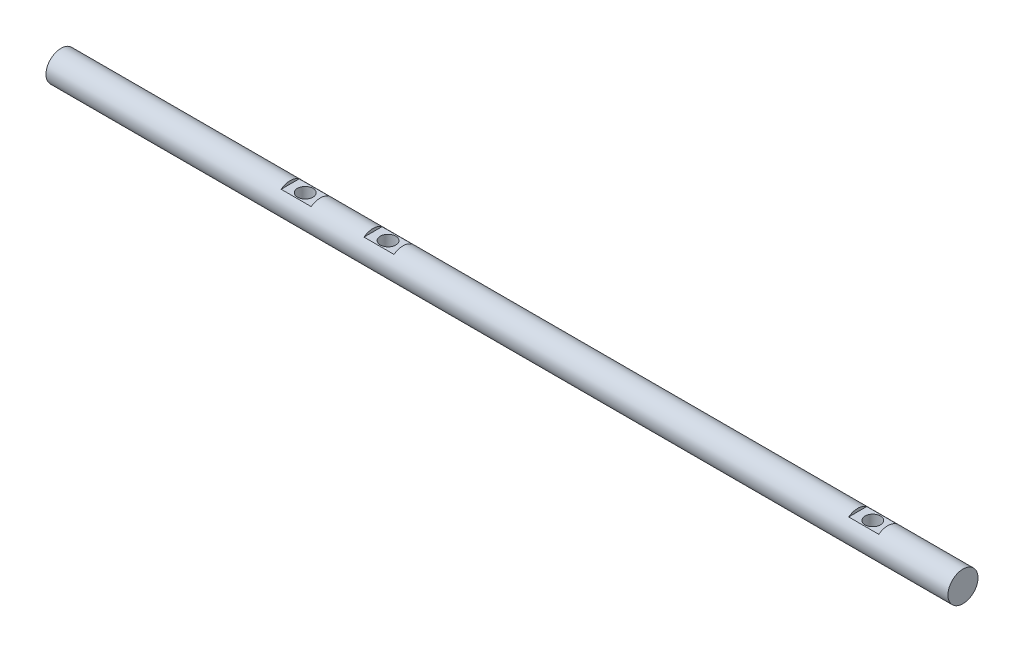
ISO-10303-21;
HEADER;
FILE_DESCRIPTION(('STEP AP214'),'2;1');
FILE_NAME('part.step','',(''),(''),'','','');
FILE_SCHEMA(('AUTOMOTIVE_DESIGN { 1 0 10303 214 1 1 1 1 }'));
ENDSEC;
DATA;
#1=APPLICATION_CONTEXT('core data for automotive mechanical design processes');
#2=APPLICATION_PROTOCOL_DEFINITION('international standard','automotive_design',2000,#1);
#3=PRODUCT_CONTEXT('',#1,'mechanical');
#4=PRODUCT('Part','Part','',(#3));
#5=PRODUCT_RELATED_PRODUCT_CATEGORY('part','',(#4));
#6=PRODUCT_DEFINITION_FORMATION('','',#4);
#7=PRODUCT_DEFINITION_CONTEXT('part definition',#1,'design');
#8=PRODUCT_DEFINITION('design','',#6,#7);
#9=PRODUCT_DEFINITION_SHAPE('','',#8);
#10=(LENGTH_UNIT() NAMED_UNIT(*) SI_UNIT(.MILLI.,.METRE.));
#11=(NAMED_UNIT(*) PLANE_ANGLE_UNIT() SI_UNIT($,.RADIAN.));
#12=(NAMED_UNIT(*) SI_UNIT($,.STERADIAN.) SOLID_ANGLE_UNIT());
#13=UNCERTAINTY_MEASURE_WITH_UNIT(LENGTH_MEASURE(1.E-05),#10,'distance_accuracy_value','');
#14=(GEOMETRIC_REPRESENTATION_CONTEXT(3) GLOBAL_UNCERTAINTY_ASSIGNED_CONTEXT((#13)) GLOBAL_UNIT_ASSIGNED_CONTEXT((#10,
#11,#12)) REPRESENTATION_CONTEXT('',''));
#15=CARTESIAN_POINT('',(0.,0.,0.));
#16=DIRECTION('',(0.,0.,1.));
#17=DIRECTION('',(1.,0.,0.));
#18=AXIS2_PLACEMENT_3D('',#15,#16,#17);
#19=CARTESIAN_POINT('',(190.5,0.,0.));
#20=DIRECTION('',(-1.,0.,0.));
#21=DIRECTION('',(0.,0.,1.));
#22=AXIS2_PLACEMENT_3D('',#19,#20,#21);
#23=CYLINDRICAL_SURFACE('',#22,3.175);
#24=CARTESIAN_POINT('',(51.575,-2.72348383463167,1.63195));
#25=CARTESIAN_POINT('',(51.659661054533,-2.72349182256906,1.63194379752894));
#26=CARTESIAN_POINT('',(51.7444204392266,-2.72749215276108,1.62531753058085));
#27=CARTESIAN_POINT('',(51.9113071732483,-2.74290244353224,1.59916427271717));
#28=CARTESIAN_POINT('',(51.9934289651544,-2.7543270936278,1.57961170491465));
#29=CARTESIAN_POINT('',(52.1523073480636,-2.78290574682444,1.52869210798094));
#30=CARTESIAN_POINT('',(52.2290909891458,-2.80002785921445,1.49739071903737));
#31=CARTESIAN_POINT('',(52.3762960294521,-2.83802217473559,1.42406300104363));
#32=CARTESIAN_POINT('',(52.4467167832897,-2.85889475763595,1.38203558570447));
#33=CARTESIAN_POINT('',(52.5859898994264,-2.90426497665549,1.2841432220861));
#34=CARTESIAN_POINT('',(52.6541666642702,-2.92892000073408,1.22738963363431));
#35=CARTESIAN_POINT('',(52.7805641124886,-2.9778093405792,1.10350043067065));
#36=CARTESIAN_POINT('',(52.8387795816996,-3.00204343008415,1.0363594137374));
#37=CARTESIAN_POINT('',(52.9477249198406,-3.04945231471908,0.887679954651337));
#38=CARTESIAN_POINT('',(52.9976102887409,-3.07242413634048,0.805451844706501));
#39=CARTESIAN_POINT('',(53.0825293456899,-3.11265266784556,0.632367669562943));
#40=CARTESIAN_POINT('',(53.1175729294104,-3.1299131840233,0.541517402762775));
#41=CARTESIAN_POINT('',(53.1690928763704,-3.15563579512015,0.360936838435684));
#42=CARTESIAN_POINT('',(53.1867578493752,-3.1646575034205,0.271627207664634));
#43=CARTESIAN_POINT('',(53.2069472245883,-3.17498597269212,0.0908926129676999));
#44=CARTESIAN_POINT('',(53.2094813924849,-3.17629770980621,-0.000530948325934771));
#45=CARTESIAN_POINT('',(53.1997643964494,-3.17131116186595,-0.173904353321177));
#46=CARTESIAN_POINT('',(53.1888488046144,-3.16570023452542,-0.255953622474569));
#47=CARTESIAN_POINT('',(53.1549513637835,-3.14855477347619,-0.416864105150143));
#48=CARTESIAN_POINT('',(53.1319686069565,-3.13701979409342,-0.495725078331132));
#49=CARTESIAN_POINT('',(53.0744762680085,-3.10888382420753,-0.649346627773992));
#50=CARTESIAN_POINT('',(53.0398189946015,-3.09221817204445,-0.724039597357666));
#51=CARTESIAN_POINT('',(52.960184461767,-3.05529974110177,-0.866722331226089));
#52=CARTESIAN_POINT('',(52.9152035886488,-3.03504570680615,-0.934709736340776));
#53=CARTESIAN_POINT('',(52.8111264483902,-2.99047613889967,-1.06919405063318));
#54=CARTESIAN_POINT('',(52.7510768091178,-2.96595706541559,-1.13488615158108));
#55=CARTESIAN_POINT('',(52.6211004891639,-2.91685933021604,-1.2557144587683));
#56=CARTESIAN_POINT('',(52.5511655482564,-2.89228063573605,-1.3108417452859));
#57=CARTESIAN_POINT('',(52.3974480893501,-2.84395893131147,-1.41277173009831));
#58=CARTESIAN_POINT('',(52.3130393732356,-2.82039438056391,-1.45872336321263));
#59=CARTESIAN_POINT('',(52.1362159440929,-2.77938428280676,-1.53543409409062));
#60=CARTESIAN_POINT('',(52.0438100665063,-2.76193208769491,-1.56620971300506));
#61=CARTESIAN_POINT('',(51.8613940133354,-2.73713422627123,-1.60912843734647));
#62=CARTESIAN_POINT('',(51.7717886686666,-2.72908873914087,-1.62257078895259));
#63=CARTESIAN_POINT('',(51.5912650937249,-2.72204404706553,-1.63436816189779));
#64=CARTESIAN_POINT('',(51.5003479794244,-2.72303755867369,-1.63273533050626));
#65=CARTESIAN_POINT('',(51.331322388153,-2.73321450298551,-1.61562118491546));
#66=CARTESIAN_POINT('',(51.2529752349708,-2.74141110773815,-1.60180785085065));
#67=CARTESIAN_POINT('',(51.0998781925813,-2.76357748877003,-1.56325147782028));
#68=CARTESIAN_POINT('',(51.0251295689452,-2.77754927980894,-1.53850462432609));
#69=CARTESIAN_POINT('',(50.8774364145049,-2.8104321930162,-1.47761287981712));
#70=CARTESIAN_POINT('',(50.8047312287633,-2.82954019572483,-1.4409979511085));
#71=CARTESIAN_POINT('',(50.6660698707463,-2.87038662220465,-1.35781148678162));
#72=CARTESIAN_POINT('',(50.6001172004898,-2.89212639825046,-1.31123482305627));
#73=CARTESIAN_POINT('',(50.4675326462737,-2.93930368870587,-1.20212503934688));
#74=CARTESIAN_POINT('',(50.4020059197546,-2.96484484048215,-1.13828767661312));
#75=CARTESIAN_POINT('',(50.2822216558231,-3.01424291964405,-1.00017194704556));
#76=CARTESIAN_POINT('',(50.2279686337795,-3.03809916967359,-0.9258894165856));
#77=CARTESIAN_POINT('',(50.1307378960403,-3.08242155942658,-0.765776129086204));
#78=CARTESIAN_POINT('',(50.0881812167069,-3.10275322874678,-0.67964975191091));
#79=CARTESIAN_POINT('',(50.0185968587023,-3.13669037529254,-0.500114447544521));
#80=CARTESIAN_POINT('',(49.9915548023858,-3.15030207837904,-0.406712354359519));
#81=CARTESIAN_POINT('',(49.9562169475537,-3.16821985923694,-0.224842647361091));
#82=CARTESIAN_POINT('',(49.9463855429565,-3.17328651654776,-0.136748051228279));
#83=CARTESIAN_POINT('',(49.9411495817996,-3.17597594886581,0.039969155756561));
#84=CARTESIAN_POINT('',(49.9457393606086,-3.17360164667802,0.128591545641851));
#85=CARTESIAN_POINT('',(49.9682341184248,-3.16211638630792,0.297101351786299));
#86=CARTESIAN_POINT('',(49.9851553706888,-3.15350340321957,0.377157910048484));
#87=CARTESIAN_POINT('',(50.0304565880524,-3.13090947178978,0.533146883793698));
#88=CARTESIAN_POINT('',(50.058838111329,-3.11692779351518,0.609078736874574));
#89=CARTESIAN_POINT('',(50.1274362626648,-3.08413058191329,0.758175719014643));
#90=CARTESIAN_POINT('',(50.168090042299,-3.06514051047963,0.831100128678889));
#91=CARTESIAN_POINT('',(50.2595375389881,-3.02425752041576,0.969380815512264));
#92=CARTESIAN_POINT('',(50.3103358378238,-3.00236329162615,1.03473365182215));
#93=CARTESIAN_POINT('',(50.4267525522572,-2.95511695981165,1.1632141757042));
#94=CARTESIAN_POINT('',(50.4933639897751,-2.92964234844988,1.2253992434318));
#95=CARTESIAN_POINT('',(50.6363499734334,-2.8799198098258,1.33809203717121));
#96=CARTESIAN_POINT('',(50.7127339132705,-2.8556730945824,1.38858839460528));
#97=CARTESIAN_POINT('',(50.8770966934477,-2.81032865180632,1.47827897940419));
#98=CARTESIAN_POINT('',(50.9654199198805,-2.78939830591524,1.516932412158));
#99=CARTESIAN_POINT('',(51.148703912364,-2.75519325911029,1.57822576845088));
#100=CARTESIAN_POINT('',(51.2436414377597,-2.74189313244535,1.60091893329051));
#101=CARTESIAN_POINT('',(51.3789214024918,-2.73025542808247,1.6206054161196));
#102=CARTESIAN_POINT('',(51.4179644080167,-2.72772638067094,1.62485214303481));
#103=CARTESIAN_POINT('',(51.4963311845963,-2.72433867376105,1.63052596745716));
#104=CARTESIAN_POINT('',(51.5356549736535,-2.72348012235087,1.6319528825106));
#105=CARTESIAN_POINT('',(51.575,-2.72348383463167,1.63195));
#106=B_SPLINE_CURVE_WITH_KNOTS('',3,(#24,#25,#26,#27,#28,#29,#30,#31,#32,#33,#34,#35,#36,#37,
#38,#39,#40,#41,#42,#43,#44,#45,#46,#47,#48,#49,#50,#51,#52,#53,#54,#55,#56,#57,#58,#59,#60,#61,
#62,#63,#64,#65,#66,#67,#68,#69,#70,#71,#72,#73,#74,#75,#76,#77,#78,#79,#80,#81,#82,#83,#84,#85,
#86,#87,#88,#89,#90,#91,#92,#93,#94,#95,#96,#97,#98,#99,#100,#101,#102,#103,#104,#105),
.UNSPECIFIED.,.T.,.F.,(4,2,2,2,2,2,2,2,2,2,2,2,2,2,2,2,2,2,2,2,2,2,2,2,2,2,2,2,2,2,2,2,2,2,2,2,
2,2,2,2,4),(0.,0.253817339683726,0.508138409372511,0.761059250522616,1.01400571665442,
1.28907050621139,1.56427883877217,1.85936711314689,2.15425832825253,2.42718340716243,
2.69993231635587,2.94764983384078,3.1953859901646,3.44638186771887,3.69746573866884,
3.97325375164303,4.2492735924873,4.54458418965424,4.83957258750042,5.11084110226888,
5.38189105359068,5.62074530639265,5.85968295747756,6.10956179595417,6.35956957813041,
6.64325335503989,6.92705053552188,7.22001901775594,7.51271556111259,7.77763246664319,
8.04244532599686,8.28816818579199,8.5339244661488,8.78974697485721,9.04568528840799,
9.3283114575375,9.61121136791527,9.90557298280056,10.198947928869,10.3168983119551,
10.4348563266779),.UNSPECIFIED.);
#107=CARTESIAN_POINT('',(51.575,-2.72348383463167,1.63195));
#108=VERTEX_POINT('',#107);
#109=EDGE_CURVE('E103',#108,#108,#106,.T.);
#110=ORIENTED_EDGE('',*,*,#109,.T.);
#111=EDGE_LOOP('',(#110));
#112=FACE_BOUND('',#111,.T.);
#113=CARTESIAN_POINT('',(171.45,-2.72348383463165,1.63195000000003));
#114=CARTESIAN_POINT('',(171.534661054533,-2.72349182256904,1.63194379752897));
#115=CARTESIAN_POINT('',(171.619420439227,-2.72749215276106,1.62531753058089));
#116=CARTESIAN_POINT('',(171.786307173248,-2.74290244353222,1.59916427271721));
#117=CARTESIAN_POINT('',(171.868428965154,-2.75432709362778,1.57961170491468));
#118=CARTESIAN_POINT('',(172.027307348064,-2.78290574682443,1.52869210798097));
#119=CARTESIAN_POINT('',(172.104090989146,-2.80002785921443,1.4973907190374));
#120=CARTESIAN_POINT('',(172.251296029452,-2.83802217473557,1.42406300104367));
#121=CARTESIAN_POINT('',(172.32171678329,-2.85889475763593,1.38203558570451));
#122=CARTESIAN_POINT('',(172.460989899426,-2.90426497665547,1.28414322208614));
#123=CARTESIAN_POINT('',(172.52916666427,-2.92892000073406,1.22738963363435));
#124=CARTESIAN_POINT('',(172.655564112489,-2.97780934057919,1.10350043067068));
#125=CARTESIAN_POINT('',(172.7137795817,-3.00204343008414,1.03635941373742));
#126=CARTESIAN_POINT('',(172.822724919841,-3.04945231471908,0.88767995465136));
#127=CARTESIAN_POINT('',(172.872610288741,-3.07242413634047,0.805451844706529));
#128=CARTESIAN_POINT('',(172.95752934569,-3.11265266784555,0.632367669562965));
#129=CARTESIAN_POINT('',(172.99257292941,-3.1299131840233,0.541517402762789));
#130=CARTESIAN_POINT('',(173.04409287637,-3.15563579512014,0.36093683843569));
#131=CARTESIAN_POINT('',(173.061757849375,-3.1646575034205,0.271627207664641));
#132=CARTESIAN_POINT('',(173.081947224588,-3.17498597269212,0.0908926129677056));
#133=CARTESIAN_POINT('',(173.084481392485,-3.17629770980621,-0.000530948325930556));
#134=CARTESIAN_POINT('',(173.074764396449,-3.17131116186595,-0.173904353321176));
#135=CARTESIAN_POINT('',(173.063848804614,-3.16570023452542,-0.25595362247457));
#136=CARTESIAN_POINT('',(173.029951363784,-3.14855477347619,-0.416864105150149));
#137=CARTESIAN_POINT('',(173.006968606956,-3.13701979409342,-0.49572507833114));
#138=CARTESIAN_POINT('',(172.949476268009,-3.10888382420753,-0.649346627774001));
#139=CARTESIAN_POINT('',(172.914818994602,-3.09221817204445,-0.724039597357675));
#140=CARTESIAN_POINT('',(172.835184461767,-3.05529974110176,-0.8667223312261));
#141=CARTESIAN_POINT('',(172.790203588649,-3.03504570680615,-0.934709736340789));
#142=CARTESIAN_POINT('',(172.68612644839,-2.99047613889967,-1.06919405063319));
#143=CARTESIAN_POINT('',(172.626076809118,-2.96595706541559,-1.13488615158109));
#144=CARTESIAN_POINT('',(172.496100489164,-2.91685933021603,-1.25571445876832));
#145=CARTESIAN_POINT('',(172.426165548256,-2.89228063573604,-1.31084174528592));
#146=CARTESIAN_POINT('',(172.27244808935,-2.84395893131145,-1.41277173009834));
#147=CARTESIAN_POINT('',(172.188039373236,-2.82039438056389,-1.45872336321266));
#148=CARTESIAN_POINT('',(172.011215944093,-2.77938428280675,-1.53543409409065));
#149=CARTESIAN_POINT('',(171.918810066506,-2.76193208769489,-1.56620971300509));
#150=CARTESIAN_POINT('',(171.736394013335,-2.73713422627122,-1.6091284373465));
#151=CARTESIAN_POINT('',(171.646788668667,-2.72908873914085,-1.62257078895263));
#152=CARTESIAN_POINT('',(171.466265093725,-2.72204404706551,-1.63436816189783));
#153=CARTESIAN_POINT('',(171.375347979424,-2.72303755867367,-1.6327353305063));
#154=CARTESIAN_POINT('',(171.206322388153,-2.73321450298549,-1.6156211849155));
#155=CARTESIAN_POINT('',(171.127975234971,-2.74141110773812,-1.60180785085068));
#156=CARTESIAN_POINT('',(170.974878192581,-2.76357748877001,-1.56325147782032));
#157=CARTESIAN_POINT('',(170.900129568945,-2.77754927980892,-1.53850462432613));
#158=CARTESIAN_POINT('',(170.752436414505,-2.81043219301618,-1.47761287981716));
#159=CARTESIAN_POINT('',(170.679731228763,-2.82954019572481,-1.44099795110855));
#160=CARTESIAN_POINT('',(170.541069870746,-2.87038662220463,-1.35781148678167));
#161=CARTESIAN_POINT('',(170.47511720049,-2.89212639825044,-1.31123482305632));
#162=CARTESIAN_POINT('',(170.342532646274,-2.93930368870585,-1.20212503934693));
#163=CARTESIAN_POINT('',(170.277005919755,-2.96484484048213,-1.13828767661317));
#164=CARTESIAN_POINT('',(170.157221655823,-3.01424291964403,-1.00017194704562));
#165=CARTESIAN_POINT('',(170.102968633779,-3.03809916967357,-0.925889416585651));
#166=CARTESIAN_POINT('',(170.00573789604,-3.08242155942657,-0.765776129086246));
#167=CARTESIAN_POINT('',(169.963181216707,-3.10275322874678,-0.679649751910946));
#168=CARTESIAN_POINT('',(169.893596858702,-3.13669037529254,-0.500114447544549));
#169=CARTESIAN_POINT('',(169.866554802386,-3.15030207837904,-0.406712354359548));
#170=CARTESIAN_POINT('',(169.831216947554,-3.16821985923694,-0.224842647361114));
#171=CARTESIAN_POINT('',(169.821385542956,-3.17328651654776,-0.136748051228297));
#172=CARTESIAN_POINT('',(169.8161495818,-3.17597594886581,0.0399691557565508));
#173=CARTESIAN_POINT('',(169.820739360609,-3.17360164667802,0.128591545641843));
#174=CARTESIAN_POINT('',(169.843234118425,-3.16211638630792,0.297101351786296));
#175=CARTESIAN_POINT('',(169.860155370689,-3.15350340321957,0.377157910048484));
#176=CARTESIAN_POINT('',(169.905456588052,-3.13090947178978,0.5331468837937));
#177=CARTESIAN_POINT('',(169.933838111329,-3.11692779351517,0.609078736874576));
#178=CARTESIAN_POINT('',(170.002436262665,-3.08413058191329,0.75817571901465));
#179=CARTESIAN_POINT('',(170.043090042299,-3.06514051047963,0.831100128678901));
#180=CARTESIAN_POINT('',(170.134537538988,-3.02425752041575,0.969380815512277));
#181=CARTESIAN_POINT('',(170.185335837824,-3.00236329162614,1.03473365182216));
#182=CARTESIAN_POINT('',(170.301752552257,-2.95511695981165,1.16321417570421));
#183=CARTESIAN_POINT('',(170.368363989775,-2.92964234844988,1.2253992434318));
#184=CARTESIAN_POINT('',(170.511349973433,-2.87991980982579,1.33809203717122));
#185=CARTESIAN_POINT('',(170.58773391327,-2.85567309458239,1.38858839460529));
#186=CARTESIAN_POINT('',(170.752096693448,-2.81032865180631,1.4782789794042));
#187=CARTESIAN_POINT('',(170.84041991988,-2.78939830591523,1.51693241215802));
#188=CARTESIAN_POINT('',(171.023703912364,-2.75519325911028,1.57822576845091));
#189=CARTESIAN_POINT('',(171.11864143776,-2.74189313244533,1.60091893329055));
#190=CARTESIAN_POINT('',(171.253921402492,-2.73025542808245,1.62060541611964));
#191=CARTESIAN_POINT('',(171.292964408017,-2.72772638067092,1.62485214303485));
#192=CARTESIAN_POINT('',(171.371331184596,-2.72433867376103,1.6305259674572));
#193=CARTESIAN_POINT('',(171.410654973654,-2.72348012235085,1.63195288251063));
#194=CARTESIAN_POINT('',(171.45,-2.72348383463165,1.63195000000003));
#195=B_SPLINE_CURVE_WITH_KNOTS('',3,(#113,#114,#115,#116,#117,#118,#119,#120,#121,#122,#123,
#124,#125,#126,#127,#128,#129,#130,#131,#132,#133,#134,#135,#136,#137,#138,#139,#140,#141,#142,
#143,#144,#145,#146,#147,#148,#149,#150,#151,#152,#153,#154,#155,#156,#157,#158,#159,#160,#161,
#162,#163,#164,#165,#166,#167,#168,#169,#170,#171,#172,#173,#174,#175,#176,#177,#178,#179,#180,
#181,#182,#183,#184,#185,#186,#187,#188,#189,#190,#191,#192,#193,#194),.UNSPECIFIED.,.T.,.F.,(4,
2,2,2,2,2,2,2,2,2,2,2,2,2,2,2,2,2,2,2,2,2,2,2,2,2,2,2,2,2,2,2,2,2,2,2,2,2,2,2,4),(0.,
0.253817339683747,0.508138409372526,0.761059250522618,1.01400571665441,1.28907050621141,
1.56427883877218,1.85936711314692,2.15425832825257,2.42718340716248,2.69993231635592,
2.94764983384084,3.19538599016466,3.44638186771894,3.69746573866891,3.9732537516431,
4.24927359248739,4.54458418965433,4.8395725875005,5.11084110226898,5.38189105359078,
5.62074530639276,5.85968295747765,6.10956179595428,6.35956957813052,6.64325335503999,
6.927050535522,7.22001901775608,7.51271556111274,7.77763246664335,8.04244532599703,
8.28816818579216,8.53392446614898,8.7897469748574,9.04568528840817,9.32831145753767,
9.61121136791544,9.90557298280072,10.1989479288692,10.3168983119554,10.4348563266781),.UNSPECIFIED.);
#196=CARTESIAN_POINT('',(171.45,-2.72348383463165,1.63195000000003));
#197=VERTEX_POINT('',#196);
#198=EDGE_CURVE('E134',#197,#197,#195,.T.);
#199=ORIENTED_EDGE('',*,*,#198,.T.);
#200=EDGE_LOOP('',(#199));
#201=FACE_BOUND('',#200,.T.);
#202=CARTESIAN_POINT('',(190.5,0.,0.));
#203=DIRECTION('',(1.,0.,0.));
#204=DIRECTION('',(0.,0.,-1.));
#205=AXIS2_PLACEMENT_3D('',#202,#203,#204);
#206=CIRCLE('',#205,3.175);
#207=CARTESIAN_POINT('',(190.5,0.,-3.175));
#208=VERTEX_POINT('',#207);
#209=EDGE_CURVE('E131',#208,#208,#206,.T.);
#210=ORIENTED_EDGE('',*,*,#209,.F.);
#211=EDGE_LOOP('',(#210));
#212=FACE_BOUND('',#211,.T.);
#213=CARTESIAN_POINT('',(0.,0.,0.));
#214=DIRECTION('',(1.,0.,0.));
#215=DIRECTION('',(0.,0.,-1.));
#216=AXIS2_PLACEMENT_3D('',#213,#214,#215);
#217=CIRCLE('',#216,3.175);
#218=CARTESIAN_POINT('',(0.,0.,-3.175));
#219=VERTEX_POINT('',#218);
#220=EDGE_CURVE('E130',#219,#219,#217,.T.);
#221=ORIENTED_EDGE('',*,*,#220,.T.);
#222=EDGE_LOOP('',(#221));
#223=FACE_BOUND('',#222,.T.);
#224=CARTESIAN_POINT('',(69.075,-2.72348383463167,1.63194999999999));
#225=CARTESIAN_POINT('',(68.990338945467,-2.72349182256906,1.63194379752893));
#226=CARTESIAN_POINT('',(68.9055795607733,-2.72749215276109,1.62531753058084));
#227=CARTESIAN_POINT('',(68.7386928267517,-2.74290244353225,1.59916427271717));
#228=CARTESIAN_POINT('',(68.6565710348456,-2.7543270936278,1.57961170491464));
#229=CARTESIAN_POINT('',(68.4976926519364,-2.78290574682445,1.52869210798093));
#230=CARTESIAN_POINT('',(68.4209090108542,-2.80002785921446,1.49739071903735));
#231=CARTESIAN_POINT('',(68.2737039705479,-2.83802217473559,1.42406300104362));
#232=CARTESIAN_POINT('',(68.2032832167102,-2.85889475763596,1.38203558570446));
#233=CARTESIAN_POINT('',(68.0640101005736,-2.90426497665549,1.28414322208609));
#234=CARTESIAN_POINT('',(67.9958333357298,-2.92892000073408,1.22738963363429));
#235=CARTESIAN_POINT('',(67.8694358875114,-2.9778093405792,1.10350043067064));
#236=CARTESIAN_POINT('',(67.8112204183004,-3.00204343008415,1.03635941373739));
#237=CARTESIAN_POINT('',(67.7022750801594,-3.04945231471908,0.887679954651335));
#238=CARTESIAN_POINT('',(67.6523897112591,-3.07242413634048,0.805451844706497));
#239=CARTESIAN_POINT('',(67.56747065431,-3.11265266784556,0.632367669562934));
#240=CARTESIAN_POINT('',(67.5324270705896,-3.1299131840233,0.541517402762765));
#241=CARTESIAN_POINT('',(67.4809071236296,-3.15563579512015,0.360936838435675));
#242=CARTESIAN_POINT('',(67.4632421506248,-3.1646575034205,0.271627207664629));
#243=CARTESIAN_POINT('',(67.4430527754117,-3.17498597269212,0.0908926129676999));
#244=CARTESIAN_POINT('',(67.4405186075151,-3.17629770980621,-0.000530948325932522));
#245=CARTESIAN_POINT('',(67.4502356035506,-3.17131116186595,-0.173904353321173));
#246=CARTESIAN_POINT('',(67.4611511953857,-3.16570023452542,-0.255953622474567));
#247=CARTESIAN_POINT('',(67.4950486362165,-3.14855477347619,-0.416864105150141));
#248=CARTESIAN_POINT('',(67.5180313930435,-3.13701979409342,-0.49572507833113));
#249=CARTESIAN_POINT('',(67.5755237319915,-3.10888382420753,-0.649346627773992));
#250=CARTESIAN_POINT('',(67.6101810053985,-3.09221817204445,-0.724039597357669));
#251=CARTESIAN_POINT('',(67.689815538233,-3.05529974110177,-0.86672233122609));
#252=CARTESIAN_POINT('',(67.7347964113512,-3.03504570680615,-0.934709736340774));
#253=CARTESIAN_POINT('',(67.8388735516099,-2.99047613889968,-1.06919405063317));
#254=CARTESIAN_POINT('',(67.8989231908822,-2.96595706541559,-1.13488615158108));
#255=CARTESIAN_POINT('',(68.0288995108361,-2.91685933021604,-1.25571445876829));
#256=CARTESIAN_POINT('',(68.0988344517436,-2.89228063573606,-1.31084174528589));
#257=CARTESIAN_POINT('',(68.2525519106498,-2.84395893131147,-1.4127717300983));
#258=CARTESIAN_POINT('',(68.3369606267644,-2.82039438056391,-1.45872336321262));
#259=CARTESIAN_POINT('',(68.5137840559071,-2.77938428280677,-1.53543409409061));
#260=CARTESIAN_POINT('',(68.6061899334937,-2.76193208769491,-1.56620971300505));
#261=CARTESIAN_POINT('',(68.7886059866646,-2.73713422627124,-1.60912843734646));
#262=CARTESIAN_POINT('',(68.8782113313334,-2.72908873914087,-1.62257078895258));
#263=CARTESIAN_POINT('',(69.0587349062751,-2.72204404706553,-1.63436816189779));
#264=CARTESIAN_POINT('',(69.1496520205756,-2.72303755867369,-1.63273533050626));
#265=CARTESIAN_POINT('',(69.318677611847,-2.73321450298552,-1.61562118491545));
#266=CARTESIAN_POINT('',(69.3970247650292,-2.74141110773815,-1.60180785085064));
#267=CARTESIAN_POINT('',(69.5501218074187,-2.76357748877003,-1.56325147782027));
#268=CARTESIAN_POINT('',(69.6248704310548,-2.77754927980894,-1.53850462432608));
#269=CARTESIAN_POINT('',(69.772563585495,-2.8104321930162,-1.47761287981711));
#270=CARTESIAN_POINT('',(69.8452687712367,-2.82954019572483,-1.4409979511085));
#271=CARTESIAN_POINT('',(69.9839301292537,-2.87038662220465,-1.35781148678161));
#272=CARTESIAN_POINT('',(70.0498827995102,-2.89212639825046,-1.31123482305626));
#273=CARTESIAN_POINT('',(70.1824673537263,-2.93930368870588,-1.20212503934688));
#274=CARTESIAN_POINT('',(70.2479940802454,-2.96484484048215,-1.13828767661312));
#275=CARTESIAN_POINT('',(70.3677783441769,-3.01424291964405,-1.00017194704557));
#276=CARTESIAN_POINT('',(70.4220313662205,-3.03809916967358,-0.925889416585601));
#277=CARTESIAN_POINT('',(70.5192621039597,-3.08242155942658,-0.765776129086203));
#278=CARTESIAN_POINT('',(70.5618187832931,-3.10275322874678,-0.679649751910908));
#279=CARTESIAN_POINT('',(70.6314031412977,-3.13669037529254,-0.500114447544518));
#280=CARTESIAN_POINT('',(70.6584451976142,-3.15030207837904,-0.406712354359516));
#281=CARTESIAN_POINT('',(70.6937830524463,-3.16821985923694,-0.224842647361088));
#282=CARTESIAN_POINT('',(70.7036144570435,-3.17328651654776,-0.136748051228276));
#283=CARTESIAN_POINT('',(70.7088504182003,-3.17597594886581,0.039969155756565));
#284=CARTESIAN_POINT('',(70.7042606393914,-3.17360164667802,0.128591545641855));
#285=CARTESIAN_POINT('',(70.6817658815752,-3.16211638630792,0.297101351786302));
#286=CARTESIAN_POINT('',(70.6648446293112,-3.15350340321957,0.377157910048486));
#287=CARTESIAN_POINT('',(70.6195434119476,-3.13090947178978,0.533146883793699));
#288=CARTESIAN_POINT('',(70.591161888671,-3.11692779351517,0.609078736874574));
#289=CARTESIAN_POINT('',(70.5225637373351,-3.08413058191329,0.758175719014644));
#290=CARTESIAN_POINT('',(70.4819099577009,-3.06514051047963,0.831100128678889));
#291=CARTESIAN_POINT('',(70.3904624610119,-3.02425752041576,0.969380815512262));
#292=CARTESIAN_POINT('',(70.3396641621761,-3.00236329162615,1.03473365182215));
#293=CARTESIAN_POINT('',(70.2232474477428,-2.95511695981165,1.1632141757042));
#294=CARTESIAN_POINT('',(70.1566360102249,-2.92964234844988,1.22539924343179));
#295=CARTESIAN_POINT('',(70.0136500265666,-2.8799198098258,1.33809203717121));
#296=CARTESIAN_POINT('',(69.9372660867295,-2.8556730945824,1.38858839460528));
#297=CARTESIAN_POINT('',(69.7729033065523,-2.81032865180632,1.47827897940418));
#298=CARTESIAN_POINT('',(69.6845800801195,-2.78939830591525,1.51693241215799));
#299=CARTESIAN_POINT('',(69.501296087636,-2.7551932591103,1.57822576845087));
#300=CARTESIAN_POINT('',(69.4063585622403,-2.74189313244535,1.60091893329051));
#301=CARTESIAN_POINT('',(69.2710785975082,-2.73025542808247,1.62060541611959));
#302=CARTESIAN_POINT('',(69.2320355919833,-2.72772638067094,1.62485214303481));
#303=CARTESIAN_POINT('',(69.1536688154037,-2.72433867376105,1.63052596745716));
#304=CARTESIAN_POINT('',(69.1143450263465,-2.72348012235087,1.63195288251059));
#305=CARTESIAN_POINT('',(69.075,-2.72348383463167,1.63194999999999));
#306=B_SPLINE_CURVE_WITH_KNOTS('',3,(#224,#225,#226,#227,#228,#229,#230,#231,#232,#233,#234,
#235,#236,#237,#238,#239,#240,#241,#242,#243,#244,#245,#246,#247,#248,#249,#250,#251,#252,#253,
#254,#255,#256,#257,#258,#259,#260,#261,#262,#263,#264,#265,#266,#267,#268,#269,#270,#271,#272,
#273,#274,#275,#276,#277,#278,#279,#280,#281,#282,#283,#284,#285,#286,#287,#288,#289,#290,#291,
#292,#293,#294,#295,#296,#297,#298,#299,#300,#301,#302,#303,#304,#305),.UNSPECIFIED.,.T.,.F.,(4,
2,2,2,2,2,2,2,2,2,2,2,2,2,2,2,2,2,2,2,2,2,2,2,2,2,2,2,2,2,2,2,2,2,2,2,2,2,2,2,4),(0.,
0.253817339683734,0.508138409372511,0.761059250522631,1.01400571665443,1.28907050621139,
1.56427883877216,1.85936711314689,2.15425832825253,2.42718340716242,2.69993231635586,
2.94764983384077,3.19538599016459,3.44638186771886,3.69746573866883,3.97325375164302,
4.24927359248728,4.54458418965422,4.8395725875004,5.11084110226884,5.38189105359065,
5.62074530639263,5.85968295747753,6.10956179595414,6.35956957813038,6.64325335503986,
6.92705053552184,7.22001901775591,7.51271556111256,7.77763246664316,8.04244532599683,
8.28816818579195,8.53392446614877,8.78974697485718,9.04568528840796,9.32831145753747,
9.61121136791524,9.9055729828005,10.1989479288689,10.3168983119551,10.4348563266778),.UNSPECIFIED.);
#307=CARTESIAN_POINT('',(69.075,-2.72348383463167,1.63194999999999));
#308=VERTEX_POINT('',#307);
#309=EDGE_CURVE('E143',#308,#308,#306,.T.);
#310=ORIENTED_EDGE('',*,*,#309,.F.);
#311=EDGE_LOOP('',(#310));
#312=FACE_BOUND('',#311,.T.);
#313=DIRECTION('',(-1.,0.,0.));
#314=VECTOR('',#313,1.);
#315=CARTESIAN_POINT('',(190.5,2.54,-1.905));
#316=LINE('',#315,#314);
#317=CARTESIAN_POINT('',(54.75,2.54,-1.905));
#318=VERTEX_POINT('',#317);
#319=CARTESIAN_POINT('',(48.4,2.54,-1.905));
#320=VERTEX_POINT('',#319);
#321=EDGE_CURVE('E98',#318,#320,#316,.T.);
#322=ORIENTED_EDGE('',*,*,#321,.F.);
#323=CARTESIAN_POINT('',(54.75,0.,0.));
#324=DIRECTION('',(-1.,0.,0.));
#325=DIRECTION('',(0.,0.,1.));
#326=AXIS2_PLACEMENT_3D('',#323,#324,#325);
#327=CIRCLE('',#326,3.175);
#328=CARTESIAN_POINT('',(54.75,2.54,1.905));
#329=VERTEX_POINT('',#328);
#330=EDGE_CURVE('E102',#329,#318,#327,.T.);
#331=ORIENTED_EDGE('',*,*,#330,.F.);
#332=DIRECTION('',(-1.,0.,0.));
#333=VECTOR('',#332,1.);
#334=CARTESIAN_POINT('',(190.5,2.54,1.905));
#335=LINE('',#334,#333);
#336=CARTESIAN_POINT('',(48.4,2.54,1.905));
#337=VERTEX_POINT('',#336);
#338=EDGE_CURVE('E99',#337,#329,#335,.F.);
#339=ORIENTED_EDGE('',*,*,#338,.F.);
#340=CARTESIAN_POINT('',(48.4,0.,0.));
#341=DIRECTION('',(-1.,0.,0.));
#342=DIRECTION('',(0.,0.,1.));
#343=AXIS2_PLACEMENT_3D('',#340,#341,#342);
#344=CIRCLE('',#343,3.175);
#345=EDGE_CURVE('E94',#337,#320,#344,.T.);
#346=ORIENTED_EDGE('',*,*,#345,.T.);
#347=EDGE_LOOP('',(#322,#331,#339,#346));
#348=FACE_BOUND('',#347,.T.);
#349=DIRECTION('',(-1.,0.,0.));
#350=VECTOR('',#349,1.);
#351=CARTESIAN_POINT('',(190.5,2.54,-1.905));
#352=LINE('',#351,#350);
#353=CARTESIAN_POINT('',(72.25,2.54,-1.905));
#354=VERTEX_POINT('',#353);
#355=CARTESIAN_POINT('',(65.9,2.54,-1.905));
#356=VERTEX_POINT('',#355);
#357=EDGE_CURVE('E124',#354,#356,#352,.T.);
#358=ORIENTED_EDGE('',*,*,#357,.F.);
#359=CARTESIAN_POINT('',(72.25,0.,0.));
#360=DIRECTION('',(-1.,0.,0.));
#361=DIRECTION('',(0.,0.,1.));
#362=AXIS2_PLACEMENT_3D('',#359,#360,#361);
#363=CIRCLE('',#362,3.175);
#364=CARTESIAN_POINT('',(72.25,2.54,1.905));
#365=VERTEX_POINT('',#364);
#366=EDGE_CURVE('E337',#365,#354,#363,.T.);
#367=ORIENTED_EDGE('',*,*,#366,.F.);
#368=DIRECTION('',(-1.,0.,0.));
#369=VECTOR('',#368,1.);
#370=CARTESIAN_POINT('',(190.5,2.54,1.905));
#371=LINE('',#370,#369);
#372=CARTESIAN_POINT('',(65.9,2.54,1.905));
#373=VERTEX_POINT('',#372);
#374=EDGE_CURVE('E111',#373,#365,#371,.F.);
#375=ORIENTED_EDGE('',*,*,#374,.F.);
#376=CARTESIAN_POINT('',(65.9,0.,0.));
#377=DIRECTION('',(-1.,0.,0.));
#378=DIRECTION('',(0.,0.,1.));
#379=AXIS2_PLACEMENT_3D('',#376,#377,#378);
#380=CIRCLE('',#379,3.175);
#381=EDGE_CURVE('E335',#373,#356,#380,.T.);
#382=ORIENTED_EDGE('',*,*,#381,.T.);
#383=EDGE_LOOP('',(#358,#367,#375,#382));
#384=FACE_BOUND('',#383,.T.);
#385=DIRECTION('',(-1.,0.,0.));
#386=VECTOR('',#385,1.);
#387=CARTESIAN_POINT('',(190.5,2.54,-1.905));
#388=LINE('',#387,#386);
#389=CARTESIAN_POINT('',(174.625,2.54,-1.905));
#390=VERTEX_POINT('',#389);
#391=CARTESIAN_POINT('',(168.275,2.54,-1.905));
#392=VERTEX_POINT('',#391);
#393=EDGE_CURVE('E128',#390,#392,#388,.T.);
#394=ORIENTED_EDGE('',*,*,#393,.F.);
#395=CARTESIAN_POINT('',(174.625,0.,0.));
#396=DIRECTION('',(-1.,0.,0.));
#397=DIRECTION('',(0.,0.,1.));
#398=AXIS2_PLACEMENT_3D('',#395,#396,#397);
#399=CIRCLE('',#398,3.175);
#400=CARTESIAN_POINT('',(174.625,2.54,1.905));
#401=VERTEX_POINT('',#400);
#402=EDGE_CURVE('E11',#401,#390,#399,.T.);
#403=ORIENTED_EDGE('',*,*,#402,.F.);
#404=DIRECTION('',(-1.,0.,0.));
#405=VECTOR('',#404,1.);
#406=CARTESIAN_POINT('',(190.5,2.54,1.905));
#407=LINE('',#406,#405);
#408=CARTESIAN_POINT('',(168.275,2.54,1.905));
#409=VERTEX_POINT('',#408);
#410=EDGE_CURVE('E126',#409,#401,#407,.F.);
#411=ORIENTED_EDGE('',*,*,#410,.F.);
#412=CARTESIAN_POINT('',(168.275,0.,0.));
#413=DIRECTION('',(-1.,0.,0.));
#414=DIRECTION('',(0.,0.,1.));
#415=AXIS2_PLACEMENT_3D('',#412,#413,#414);
#416=CIRCLE('',#415,3.175);
#417=EDGE_CURVE('E47',#409,#392,#416,.T.);
#418=ORIENTED_EDGE('',*,*,#417,.T.);
#419=EDGE_LOOP('',(#394,#403,#411,#418));
#420=FACE_BOUND('',#419,.T.);
#421=ADVANCED_FACE('F39',(#112,#201,#212,#223,#312,#348,#384,#420),#23,.T.);
#422=CARTESIAN_POINT('',(171.45,-3.175,0.));
#423=DIRECTION('',(0.,1.,0.));
#424=DIRECTION('',(0.,0.,1.));
#425=AXIS2_PLACEMENT_3D('',#422,#423,#424);
#426=CYLINDRICAL_SURFACE('',#425,1.63195000000003);
#427=ORIENTED_EDGE('',*,*,#198,.F.);
#428=EDGE_LOOP('',(#427));
#429=FACE_BOUND('',#428,.T.);
#430=CARTESIAN_POINT('',(171.45,2.54,0.));
#431=DIRECTION('',(0.,1.,0.));
#432=DIRECTION('',(0.,0.,1.));
#433=AXIS2_PLACEMENT_3D('',#430,#431,#432);
#434=CIRCLE('',#433,1.63195000000003);
#435=CARTESIAN_POINT('',(171.45,2.54,1.63195000000003));
#436=VERTEX_POINT('',#435);
#437=EDGE_CURVE('E226',#436,#436,#434,.T.);
#438=ORIENTED_EDGE('',*,*,#437,.T.);
#439=EDGE_LOOP('',(#438));
#440=FACE_BOUND('',#439,.T.);
#441=ADVANCED_FACE('F149',(#429,#440),#426,.F.);
#442=CARTESIAN_POINT('',(69.075,-3.175,0.));
#443=DIRECTION('',(0.,1.,0.));
#444=DIRECTION('',(0.,0.,1.));
#445=AXIS2_PLACEMENT_3D('',#442,#443,#444);
#446=CYLINDRICAL_SURFACE('',#445,1.63194999999999);
#447=ORIENTED_EDGE('',*,*,#309,.T.);
#448=EDGE_LOOP('',(#447));
#449=FACE_BOUND('',#448,.T.);
#450=CARTESIAN_POINT('',(69.075,2.54,0.));
#451=DIRECTION('',(0.,1.,0.));
#452=DIRECTION('',(0.,0.,1.));
#453=AXIS2_PLACEMENT_3D('',#450,#451,#452);
#454=CIRCLE('',#453,1.63194999999999);
#455=CARTESIAN_POINT('',(69.075,2.54,1.63194999999999));
#456=VERTEX_POINT('',#455);
#457=EDGE_CURVE('E239',#456,#456,#454,.F.);
#458=ORIENTED_EDGE('',*,*,#457,.F.);
#459=EDGE_LOOP('',(#458));
#460=FACE_BOUND('',#459,.T.);
#461=ADVANCED_FACE('F153',(#449,#460),#446,.F.);
#462=CARTESIAN_POINT('',(51.575,-3.175,0.));
#463=DIRECTION('',(0.,1.,0.));
#464=DIRECTION('',(0.,0.,1.));
#465=AXIS2_PLACEMENT_3D('',#462,#463,#464);
#466=CYLINDRICAL_SURFACE('',#465,1.63195);
#467=ORIENTED_EDGE('',*,*,#109,.F.);
#468=EDGE_LOOP('',(#467));
#469=FACE_BOUND('',#468,.T.);
#470=CARTESIAN_POINT('',(51.575,2.54,0.));
#471=DIRECTION('',(0.,1.,0.));
#472=DIRECTION('',(0.,0.,1.));
#473=AXIS2_PLACEMENT_3D('',#470,#471,#472);
#474=CIRCLE('',#473,1.63195);
#475=CARTESIAN_POINT('',(51.575,2.54,1.63195));
#476=VERTEX_POINT('',#475);
#477=EDGE_CURVE('E118',#476,#476,#474,.T.);
#478=ORIENTED_EDGE('',*,*,#477,.T.);
#479=EDGE_LOOP('',(#478));
#480=FACE_BOUND('',#479,.T.);
#481=ADVANCED_FACE('F160',(#469,#480),#466,.F.);
#482=CARTESIAN_POINT('',(190.5,0.,0.));
#483=DIRECTION('',(1.,0.,0.));
#484=DIRECTION('',(0.,0.,-1.));
#485=AXIS2_PLACEMENT_3D('',#482,#483,#484);
#486=PLANE('',#485);
#487=ORIENTED_EDGE('',*,*,#209,.T.);
#488=EDGE_LOOP('',(#487));
#489=FACE_BOUND('',#488,.T.);
#490=ADVANCED_FACE('F157',(#489),#486,.T.);
#491=CARTESIAN_POINT('',(0.,0.,0.));
#492=DIRECTION('',(1.,0.,0.));
#493=DIRECTION('',(0.,0.,-1.));
#494=AXIS2_PLACEMENT_3D('',#491,#492,#493);
#495=PLANE('',#494);
#496=ORIENTED_EDGE('',*,*,#220,.F.);
#497=EDGE_LOOP('',(#496));
#498=FACE_BOUND('',#497,.T.);
#499=ADVANCED_FACE('F159',(#498),#495,.F.);
#500=CARTESIAN_POINT('',(54.75,3.175,0.));
#501=DIRECTION('',(-1.,0.,0.));
#502=DIRECTION('',(0.,0.,1.));
#503=AXIS2_PLACEMENT_3D('',#500,#501,#502);
#504=PLANE('',#503);
#505=ORIENTED_EDGE('',*,*,#330,.T.);
#506=DIRECTION('',(0.,0.,-1.));
#507=VECTOR('',#506,1.);
#508=CARTESIAN_POINT('',(54.75,2.54,0.));
#509=LINE('',#508,#507);
#510=EDGE_CURVE('E110',#329,#318,#509,.T.);
#511=ORIENTED_EDGE('',*,*,#510,.F.);
#512=EDGE_LOOP('',(#505,#511));
#513=FACE_BOUND('',#512,.T.);
#514=ADVANCED_FACE('F163',(#513),#504,.T.);
#515=CARTESIAN_POINT('',(48.4,3.175,0.));
#516=DIRECTION('',(-1.,0.,0.));
#517=DIRECTION('',(0.,0.,1.));
#518=AXIS2_PLACEMENT_3D('',#515,#516,#517);
#519=PLANE('',#518);
#520=DIRECTION('',(0.,0.,-1.));
#521=VECTOR('',#520,1.);
#522=CARTESIAN_POINT('',(48.4,2.54,0.));
#523=LINE('',#522,#521);
#524=EDGE_CURVE('E108',#337,#320,#523,.T.);
#525=ORIENTED_EDGE('',*,*,#524,.T.);
#526=ORIENTED_EDGE('',*,*,#345,.F.);
#527=EDGE_LOOP('',(#525,#526));
#528=FACE_BOUND('',#527,.T.);
#529=ADVANCED_FACE('F113',(#528),#519,.F.);
#530=CARTESIAN_POINT('',(0.,2.54,0.));
#531=DIRECTION('',(0.,1.,0.));
#532=DIRECTION('',(0.,0.,1.));
#533=AXIS2_PLACEMENT_3D('',#530,#531,#532);
#534=PLANE('',#533);
#535=ORIENTED_EDGE('',*,*,#477,.F.);
#536=EDGE_LOOP('',(#535));
#537=FACE_BOUND('',#536,.T.);
#538=ORIENTED_EDGE('',*,*,#321,.T.);
#539=ORIENTED_EDGE('',*,*,#524,.F.);
#540=ORIENTED_EDGE('',*,*,#338,.T.);
#541=ORIENTED_EDGE('',*,*,#510,.T.);
#542=EDGE_LOOP('',(#538,#539,#540,#541));
#543=FACE_BOUND('',#542,.T.);
#544=ADVANCED_FACE('F107',(#537,#543),#534,.T.);
#545=CARTESIAN_POINT('',(72.25,3.175,0.));
#546=DIRECTION('',(-1.,0.,0.));
#547=DIRECTION('',(0.,0.,1.));
#548=AXIS2_PLACEMENT_3D('',#545,#546,#547);
#549=PLANE('',#548);
#550=ORIENTED_EDGE('',*,*,#366,.T.);
#551=DIRECTION('',(0.,0.,-1.));
#552=VECTOR('',#551,1.);
#553=CARTESIAN_POINT('',(72.25,2.54,0.));
#554=LINE('',#553,#552);
#555=EDGE_CURVE('E114',#365,#354,#554,.T.);
#556=ORIENTED_EDGE('',*,*,#555,.F.);
#557=EDGE_LOOP('',(#550,#556));
#558=FACE_BOUND('',#557,.T.);
#559=ADVANCED_FACE('F198',(#558),#549,.T.);
#560=CARTESIAN_POINT('',(65.9,3.175,0.));
#561=DIRECTION('',(-1.,0.,0.));
#562=DIRECTION('',(0.,0.,1.));
#563=AXIS2_PLACEMENT_3D('',#560,#561,#562);
#564=PLANE('',#563);
#565=DIRECTION('',(0.,0.,-1.));
#566=VECTOR('',#565,1.);
#567=CARTESIAN_POINT('',(65.9,2.54,0.));
#568=LINE('',#567,#566);
#569=EDGE_CURVE('E62',#373,#356,#568,.T.);
#570=ORIENTED_EDGE('',*,*,#569,.T.);
#571=ORIENTED_EDGE('',*,*,#381,.F.);
#572=EDGE_LOOP('',(#570,#571));
#573=FACE_BOUND('',#572,.T.);
#574=ADVANCED_FACE('F202',(#573),#564,.F.);
#575=CARTESIAN_POINT('',(0.,2.54,0.));
#576=DIRECTION('',(0.,1.,0.));
#577=DIRECTION('',(0.,0.,1.));
#578=AXIS2_PLACEMENT_3D('',#575,#576,#577);
#579=PLANE('',#578);
#580=ORIENTED_EDGE('',*,*,#457,.T.);
#581=EDGE_LOOP('',(#580));
#582=FACE_BOUND('',#581,.T.);
#583=ORIENTED_EDGE('',*,*,#357,.T.);
#584=ORIENTED_EDGE('',*,*,#569,.F.);
#585=ORIENTED_EDGE('',*,*,#374,.T.);
#586=ORIENTED_EDGE('',*,*,#555,.T.);
#587=EDGE_LOOP('',(#583,#584,#585,#586));
#588=FACE_BOUND('',#587,.T.);
#589=ADVANCED_FACE('F206',(#582,#588),#579,.T.);
#590=CARTESIAN_POINT('',(174.625,3.175,0.));
#591=DIRECTION('',(-1.,0.,0.));
#592=DIRECTION('',(0.,0.,1.));
#593=AXIS2_PLACEMENT_3D('',#590,#591,#592);
#594=PLANE('',#593);
#595=ORIENTED_EDGE('',*,*,#402,.T.);
#596=DIRECTION('',(0.,0.,-1.));
#597=VECTOR('',#596,1.);
#598=CARTESIAN_POINT('',(174.625,2.54,0.));
#599=LINE('',#598,#597);
#600=EDGE_CURVE('E230',#401,#390,#599,.T.);
#601=ORIENTED_EDGE('',*,*,#600,.F.);
#602=EDGE_LOOP('',(#595,#601));
#603=FACE_BOUND('',#602,.T.);
#604=ADVANCED_FACE('F210',(#603),#594,.T.);
#605=CARTESIAN_POINT('',(168.275,3.175,3.21639555910862E-13));
#606=DIRECTION('',(-1.,0.,0.));
#607=DIRECTION('',(0.,0.,1.));
#608=AXIS2_PLACEMENT_3D('',#605,#606,#607);
#609=PLANE('',#608);
#610=DIRECTION('',(0.,0.,-1.));
#611=VECTOR('',#610,1.);
#612=CARTESIAN_POINT('',(168.275,2.54,3.21639555910862E-13));
#613=LINE('',#612,#611);
#614=EDGE_CURVE('E54',#409,#392,#613,.T.);
#615=ORIENTED_EDGE('',*,*,#614,.T.);
#616=ORIENTED_EDGE('',*,*,#417,.F.);
#617=EDGE_LOOP('',(#615,#616));
#618=FACE_BOUND('',#617,.T.);
#619=ADVANCED_FACE('F214',(#618),#609,.F.);
#620=CARTESIAN_POINT('',(0.,2.54,0.));
#621=DIRECTION('',(0.,1.,0.));
#622=DIRECTION('',(0.,0.,1.));
#623=AXIS2_PLACEMENT_3D('',#620,#621,#622);
#624=PLANE('',#623);
#625=ORIENTED_EDGE('',*,*,#437,.F.);
#626=EDGE_LOOP('',(#625));
#627=FACE_BOUND('',#626,.T.);
#628=ORIENTED_EDGE('',*,*,#393,.T.);
#629=ORIENTED_EDGE('',*,*,#614,.F.);
#630=ORIENTED_EDGE('',*,*,#410,.T.);
#631=ORIENTED_EDGE('',*,*,#600,.T.);
#632=EDGE_LOOP('',(#628,#629,#630,#631));
#633=FACE_BOUND('',#632,.T.);
#634=ADVANCED_FACE('F218',(#627,#633),#624,.T.);
#635=CLOSED_SHELL('',(#421,#441,#461,#481,#490,#499,#514,#529,#544,#559,#574,#589,#604,#619,#634));
#636=MANIFOLD_SOLID_BREP('B2',#635);
#637=ADVANCED_BREP_SHAPE_REPRESENTATION('',(#18,#636),#14);
#638=SHAPE_DEFINITION_REPRESENTATION(#9,#637);
ENDSEC;
END-ISO-10303-21;
